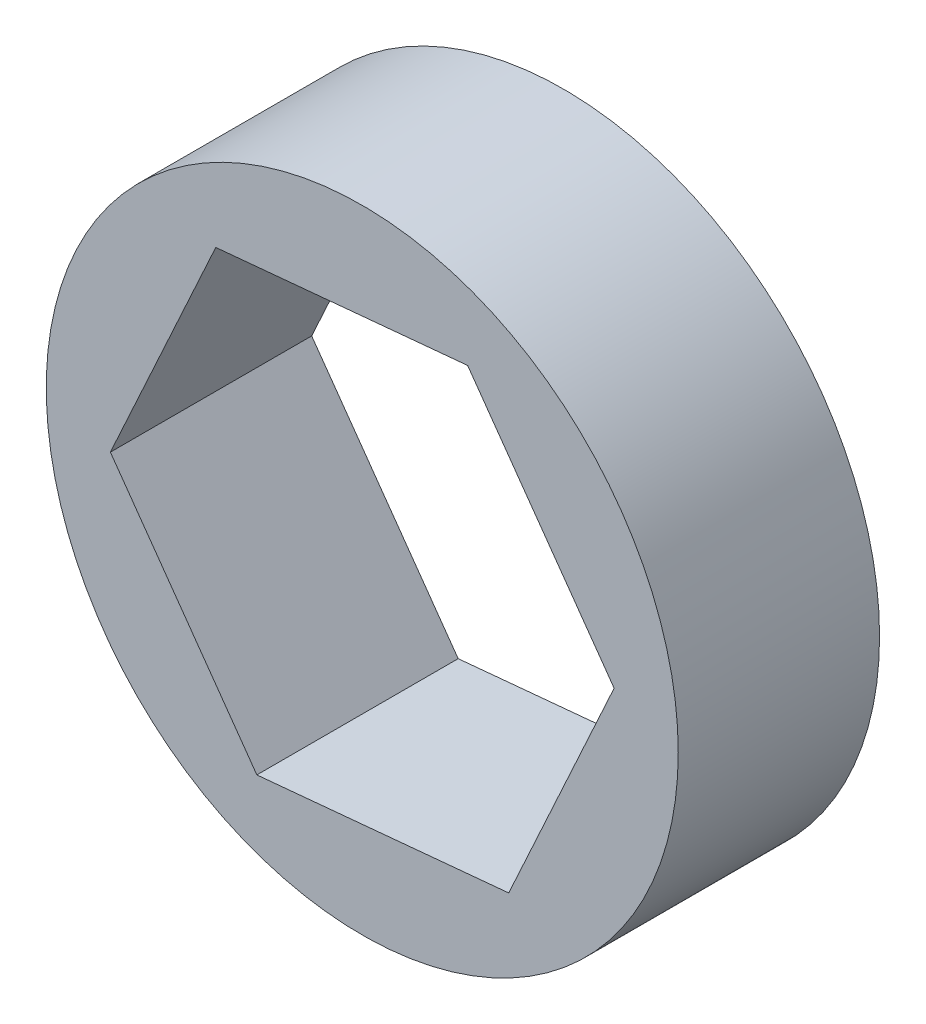
ISO-10303-21;
HEADER;
FILE_DESCRIPTION(('STEP AP214'),'2;1');
FILE_NAME('part.step','',(''),(''),'','','');
FILE_SCHEMA(('AUTOMOTIVE_DESIGN { 1 0 10303 214 1 1 1 1 }'));
ENDSEC;
DATA;
#1=APPLICATION_CONTEXT('core data for automotive mechanical design processes');
#2=APPLICATION_PROTOCOL_DEFINITION('international standard','automotive_design',2000,#1);
#3=PRODUCT_CONTEXT('',#1,'mechanical');
#4=PRODUCT('Part','Part','',(#3));
#5=PRODUCT_RELATED_PRODUCT_CATEGORY('part','',(#4));
#6=PRODUCT_DEFINITION_FORMATION('','',#4);
#7=PRODUCT_DEFINITION_CONTEXT('part definition',#1,'design');
#8=PRODUCT_DEFINITION('design','',#6,#7);
#9=PRODUCT_DEFINITION_SHAPE('','',#8);
#10=(LENGTH_UNIT() NAMED_UNIT(*) SI_UNIT(.MILLI.,.METRE.));
#11=(NAMED_UNIT(*) PLANE_ANGLE_UNIT() SI_UNIT($,.RADIAN.));
#12=(NAMED_UNIT(*) SI_UNIT($,.STERADIAN.) SOLID_ANGLE_UNIT());
#13=UNCERTAINTY_MEASURE_WITH_UNIT(LENGTH_MEASURE(1.E-05),#10,'distance_accuracy_value','');
#14=(GEOMETRIC_REPRESENTATION_CONTEXT(3) GLOBAL_UNCERTAINTY_ASSIGNED_CONTEXT((#13)) GLOBAL_UNIT_ASSIGNED_CONTEXT((#10,
#11,#12)) REPRESENTATION_CONTEXT('',''));
#15=CARTESIAN_POINT('',(0.,0.,0.));
#16=DIRECTION('',(0.,0.,1.));
#17=DIRECTION('',(1.,0.,0.));
#18=AXIS2_PLACEMENT_3D('',#15,#16,#17);
#19=CARTESIAN_POINT('',(0.,0.,6.06806));
#20=DIRECTION('',(0.,0.,1.));
#21=DIRECTION('',(1.,0.,0.));
#22=AXIS2_PLACEMENT_3D('',#19,#20,#21);
#23=PLANE('',#22);
#24=CARTESIAN_POINT('',(0.,0.,6.06806));
#25=DIRECTION('',(0.,0.,1.));
#26=DIRECTION('',(1.,0.,0.));
#27=AXIS2_PLACEMENT_3D('',#24,#25,#26);
#28=CIRCLE('',#27,9.525);
#29=CARTESIAN_POINT('',(9.525,0.,6.06806));
#30=VERTEX_POINT('',#29);
#31=EDGE_CURVE('E11',#30,#30,#28,.T.);
#32=ORIENTED_EDGE('',*,*,#31,.T.);
#33=EDGE_LOOP('',(#32));
#34=FACE_BOUND('',#33,.T.);
#35=DIRECTION('',(-0.416593831263027,-0.90909272340812,0.));
#36=VECTOR('',#35,1.);
#37=CARTESIAN_POINT('',(-4.41525056303659,6.2173936499902,6.06806));
#38=LINE('',#37,#36);
#39=CARTESIAN_POINT('',(-4.41525056303659,6.2173936499902,6.06806));
#40=VERTEX_POINT('',#39);
#41=CARTESIAN_POINT('',(-7.59204612773786,-0.715022326668133,6.06806));
#42=VERTEX_POINT('',#41);
#43=EDGE_CURVE('E94',#40,#42,#38,.T.);
#44=ORIENTED_EDGE('',*,*,#43,.F.);
#45=DIRECTION('',(-0.995594308498526,-0.0937655207703909,0.));
#46=VECTOR('',#45,1.);
#47=CARTESIAN_POINT('',(3.17679556470127,6.93241597665833,6.06806));
#48=LINE('',#47,#46);
#49=CARTESIAN_POINT('',(3.17679556470127,6.93241597665833,6.06806));
#50=VERTEX_POINT('',#49);
#51=EDGE_CURVE('E86',#50,#40,#48,.T.);
#52=ORIENTED_EDGE('',*,*,#51,.F.);
#53=DIRECTION('',(-0.579000477235499,0.815327202637729,0.));
#54=VECTOR('',#53,1.);
#55=CARTESIAN_POINT('',(7.59204612773786,0.715022326668138,6.06806));
#56=LINE('',#55,#54);
#57=CARTESIAN_POINT('',(7.59204612773786,0.715022326668138,6.06806));
#58=VERTEX_POINT('',#57);
#59=EDGE_CURVE('E114',#58,#50,#56,.T.);
#60=ORIENTED_EDGE('',*,*,#59,.F.);
#61=DIRECTION('',(0.416593831263027,0.90909272340812,0.));
#62=VECTOR('',#61,1.);
#63=CARTESIAN_POINT('',(4.41525056303659,-6.21739364999019,6.06806));
#64=LINE('',#63,#62);
#65=CARTESIAN_POINT('',(4.41525056303659,-6.21739364999019,6.06806));
#66=VERTEX_POINT('',#65);
#67=EDGE_CURVE('E112',#66,#58,#64,.T.);
#68=ORIENTED_EDGE('',*,*,#67,.F.);
#69=DIRECTION('',(0.995594308498526,0.0937655207703908,0.));
#70=VECTOR('',#69,1.);
#71=CARTESIAN_POINT('',(-3.17679556470127,-6.93241597665833,6.06806));
#72=LINE('',#71,#70);
#73=CARTESIAN_POINT('',(-3.17679556470127,-6.93241597665833,6.06806));
#74=VERTEX_POINT('',#73);
#75=EDGE_CURVE('E108',#74,#66,#72,.T.);
#76=ORIENTED_EDGE('',*,*,#75,.F.);
#77=DIRECTION('',(0.579000477235498,-0.815327202637729,0.));
#78=VECTOR('',#77,1.);
#79=CARTESIAN_POINT('',(-7.59204612773786,-0.715022326668133,6.06806));
#80=LINE('',#79,#78);
#81=EDGE_CURVE('E106',#42,#74,#80,.T.);
#82=ORIENTED_EDGE('',*,*,#81,.F.);
#83=EDGE_LOOP('',(#44,#52,#60,#68,#76,#82));
#84=FACE_BOUND('',#83,.T.);
#85=ADVANCED_FACE('F33',(#34,#84),#23,.T.);
#86=CARTESIAN_POINT('',(0.,0.,0.));
#87=DIRECTION('',(0.,0.,1.));
#88=DIRECTION('',(1.,0.,0.));
#89=AXIS2_PLACEMENT_3D('',#86,#87,#88);
#90=PLANE('',#89);
#91=CARTESIAN_POINT('',(0.,0.,0.));
#92=DIRECTION('',(0.,0.,1.));
#93=DIRECTION('',(1.,0.,0.));
#94=AXIS2_PLACEMENT_3D('',#91,#92,#93);
#95=CIRCLE('',#94,9.525);
#96=CARTESIAN_POINT('',(9.525,0.,0.));
#97=VERTEX_POINT('',#96);
#98=EDGE_CURVE('E37',#97,#97,#95,.T.);
#99=ORIENTED_EDGE('',*,*,#98,.F.);
#100=EDGE_LOOP('',(#99));
#101=FACE_BOUND('',#100,.T.);
#102=DIRECTION('',(-0.995594308498526,-0.0937655207703909,0.));
#103=VECTOR('',#102,1.);
#104=CARTESIAN_POINT('',(3.17679556470127,6.93241597665833,0.));
#105=LINE('',#104,#103);
#106=CARTESIAN_POINT('',(3.17679556470127,6.93241597665833,0.));
#107=VERTEX_POINT('',#106);
#108=CARTESIAN_POINT('',(-4.41525056303659,6.2173936499902,0.));
#109=VERTEX_POINT('',#108);
#110=EDGE_CURVE('E56',#107,#109,#105,.T.);
#111=ORIENTED_EDGE('',*,*,#110,.T.);
#112=DIRECTION('',(-0.416593831263027,-0.90909272340812,0.));
#113=VECTOR('',#112,1.);
#114=CARTESIAN_POINT('',(-4.41525056303659,6.2173936499902,0.));
#115=LINE('',#114,#113);
#116=CARTESIAN_POINT('',(-7.59204612773786,-0.715022326668133,0.));
#117=VERTEX_POINT('',#116);
#118=EDGE_CURVE('E101',#109,#117,#115,.T.);
#119=ORIENTED_EDGE('',*,*,#118,.T.);
#120=DIRECTION('',(0.579000477235498,-0.815327202637729,0.));
#121=VECTOR('',#120,1.);
#122=CARTESIAN_POINT('',(-7.59204612773786,-0.715022326668133,0.));
#123=LINE('',#122,#121);
#124=CARTESIAN_POINT('',(-3.17679556470127,-6.93241597665833,0.));
#125=VERTEX_POINT('',#124);
#126=EDGE_CURVE('E118',#117,#125,#123,.T.);
#127=ORIENTED_EDGE('',*,*,#126,.T.);
#128=DIRECTION('',(0.995594308498526,0.0937655207703908,0.));
#129=VECTOR('',#128,1.);
#130=CARTESIAN_POINT('',(-3.17679556470127,-6.93241597665833,0.));
#131=LINE('',#130,#129);
#132=CARTESIAN_POINT('',(4.41525056303659,-6.21739364999019,0.));
#133=VERTEX_POINT('',#132);
#134=EDGE_CURVE('E121',#125,#133,#131,.T.);
#135=ORIENTED_EDGE('',*,*,#134,.T.);
#136=DIRECTION('',(0.416593831263027,0.90909272340812,0.));
#137=VECTOR('',#136,1.);
#138=CARTESIAN_POINT('',(4.41525056303659,-6.21739364999019,0.));
#139=LINE('',#138,#137);
#140=CARTESIAN_POINT('',(7.59204612773786,0.715022326668138,0.));
#141=VERTEX_POINT('',#140);
#142=EDGE_CURVE('E124',#133,#141,#139,.T.);
#143=ORIENTED_EDGE('',*,*,#142,.T.);
#144=DIRECTION('',(-0.579000477235499,0.815327202637729,0.));
#145=VECTOR('',#144,1.);
#146=CARTESIAN_POINT('',(7.59204612773786,0.715022326668138,0.));
#147=LINE('',#146,#145);
#148=EDGE_CURVE('E95',#141,#107,#147,.T.);
#149=ORIENTED_EDGE('',*,*,#148,.T.);
#150=EDGE_LOOP('',(#111,#119,#127,#135,#143,#149));
#151=FACE_BOUND('',#150,.T.);
#152=ADVANCED_FACE('F141',(#101,#151),#90,.F.);
#153=CARTESIAN_POINT('',(0.,0.,6.06806));
#154=DIRECTION('',(0.,0.,-1.));
#155=DIRECTION('',(-1.,0.,0.));
#156=AXIS2_PLACEMENT_3D('',#153,#154,#155);
#157=CYLINDRICAL_SURFACE('',#156,9.525);
#158=ORIENTED_EDGE('',*,*,#31,.F.);
#159=EDGE_LOOP('',(#158));
#160=FACE_BOUND('',#159,.T.);
#161=ORIENTED_EDGE('',*,*,#98,.T.);
#162=EDGE_LOOP('',(#161));
#163=FACE_BOUND('',#162,.T.);
#164=ADVANCED_FACE('F35',(#160,#163),#157,.T.);
#165=CARTESIAN_POINT('',(3.17679556470127,6.93241597665833,6.06806));
#166=DIRECTION('',(0.0937655207703909,-0.995594308498526,0.));
#167=DIRECTION('',(0.995594308498526,0.0937655207703909,0.));
#168=AXIS2_PLACEMENT_3D('',#165,#166,#167);
#169=PLANE('',#168);
#170=ORIENTED_EDGE('',*,*,#110,.F.);
#171=DIRECTION('',(0.,0.,-1.));
#172=VECTOR('',#171,1.);
#173=CARTESIAN_POINT('',(3.17679556470127,6.93241597665833,6.06806));
#174=LINE('',#173,#172);
#175=EDGE_CURVE('E90',#50,#107,#174,.T.);
#176=ORIENTED_EDGE('',*,*,#175,.F.);
#177=ORIENTED_EDGE('',*,*,#51,.T.);
#178=DIRECTION('',(0.,0.,-1.));
#179=VECTOR('',#178,1.);
#180=CARTESIAN_POINT('',(-4.41525056303659,6.2173936499902,6.06806));
#181=LINE('',#180,#179);
#182=EDGE_CURVE('E89',#40,#109,#181,.T.);
#183=ORIENTED_EDGE('',*,*,#182,.T.);
#184=EDGE_LOOP('',(#170,#176,#177,#183));
#185=FACE_BOUND('',#184,.T.);
#186=ADVANCED_FACE('F88',(#185),#169,.T.);
#187=CARTESIAN_POINT('',(-4.41525056303659,6.2173936499902,6.06806));
#188=DIRECTION('',(0.90909272340812,-0.416593831263027,0.));
#189=DIRECTION('',(0.416593831263027,0.90909272340812,0.));
#190=AXIS2_PLACEMENT_3D('',#187,#188,#189);
#191=PLANE('',#190);
#192=ORIENTED_EDGE('',*,*,#118,.F.);
#193=ORIENTED_EDGE('',*,*,#182,.F.);
#194=ORIENTED_EDGE('',*,*,#43,.T.);
#195=DIRECTION('',(0.,0.,-1.));
#196=VECTOR('',#195,1.);
#197=CARTESIAN_POINT('',(-7.59204612773786,-0.715022326668133,6.06806));
#198=LINE('',#197,#196);
#199=EDGE_CURVE('E102',#42,#117,#198,.T.);
#200=ORIENTED_EDGE('',*,*,#199,.T.);
#201=EDGE_LOOP('',(#192,#193,#194,#200));
#202=FACE_BOUND('',#201,.T.);
#203=ADVANCED_FACE('F98',(#202),#191,.T.);
#204=CARTESIAN_POINT('',(-7.59204612773786,-0.715022326668133,6.06806));
#205=DIRECTION('',(0.815327202637729,0.579000477235499,0.));
#206=DIRECTION('',(-0.579000477235499,0.815327202637729,0.));
#207=AXIS2_PLACEMENT_3D('',#204,#205,#206);
#208=PLANE('',#207);
#209=ORIENTED_EDGE('',*,*,#126,.F.);
#210=ORIENTED_EDGE('',*,*,#199,.F.);
#211=ORIENTED_EDGE('',*,*,#81,.T.);
#212=DIRECTION('',(0.,0.,-1.));
#213=VECTOR('',#212,1.);
#214=CARTESIAN_POINT('',(-3.17679556470127,-6.93241597665833,6.06806));
#215=LINE('',#214,#213);
#216=EDGE_CURVE('E133',#74,#125,#215,.T.);
#217=ORIENTED_EDGE('',*,*,#216,.T.);
#218=EDGE_LOOP('',(#209,#210,#211,#217));
#219=FACE_BOUND('',#218,.T.);
#220=ADVANCED_FACE('F137',(#219),#208,.T.);
#221=CARTESIAN_POINT('',(-3.17679556470127,-6.93241597665833,6.06806));
#222=DIRECTION('',(-0.0937655207703908,0.995594308498526,0.));
#223=DIRECTION('',(-0.995594308498526,-0.0937655207703908,0.));
#224=AXIS2_PLACEMENT_3D('',#221,#222,#223);
#225=PLANE('',#224);
#226=ORIENTED_EDGE('',*,*,#134,.F.);
#227=ORIENTED_EDGE('',*,*,#216,.F.);
#228=ORIENTED_EDGE('',*,*,#75,.T.);
#229=DIRECTION('',(0.,0.,-1.));
#230=VECTOR('',#229,1.);
#231=CARTESIAN_POINT('',(4.41525056303659,-6.21739364999019,6.06806));
#232=LINE('',#231,#230);
#233=EDGE_CURVE('E131',#66,#133,#232,.T.);
#234=ORIENTED_EDGE('',*,*,#233,.T.);
#235=EDGE_LOOP('',(#226,#227,#228,#234));
#236=FACE_BOUND('',#235,.T.);
#237=ADVANCED_FACE('F149',(#236),#225,.T.);
#238=CARTESIAN_POINT('',(4.41525056303659,-6.21739364999019,6.06806));
#239=DIRECTION('',(-0.90909272340812,0.416593831263027,0.));
#240=DIRECTION('',(-0.416593831263027,-0.90909272340812,0.));
#241=AXIS2_PLACEMENT_3D('',#238,#239,#240);
#242=PLANE('',#241);
#243=ORIENTED_EDGE('',*,*,#142,.F.);
#244=ORIENTED_EDGE('',*,*,#233,.F.);
#245=ORIENTED_EDGE('',*,*,#67,.T.);
#246=DIRECTION('',(0.,0.,-1.));
#247=VECTOR('',#246,1.);
#248=CARTESIAN_POINT('',(7.59204612773786,0.715022326668138,6.06806));
#249=LINE('',#248,#247);
#250=EDGE_CURVE('E48',#58,#141,#249,.T.);
#251=ORIENTED_EDGE('',*,*,#250,.T.);
#252=EDGE_LOOP('',(#243,#244,#245,#251));
#253=FACE_BOUND('',#252,.T.);
#254=ADVANCED_FACE('F147',(#253),#242,.T.);
#255=CARTESIAN_POINT('',(7.59204612773786,0.715022326668138,6.06806));
#256=DIRECTION('',(-0.815327202637729,-0.579000477235499,0.));
#257=DIRECTION('',(0.579000477235499,-0.815327202637729,0.));
#258=AXIS2_PLACEMENT_3D('',#255,#256,#257);
#259=PLANE('',#258);
#260=ORIENTED_EDGE('',*,*,#148,.F.);
#261=ORIENTED_EDGE('',*,*,#250,.F.);
#262=ORIENTED_EDGE('',*,*,#59,.T.);
#263=ORIENTED_EDGE('',*,*,#175,.T.);
#264=EDGE_LOOP('',(#260,#261,#262,#263));
#265=FACE_BOUND('',#264,.T.);
#266=ADVANCED_FACE('F143',(#265),#259,.T.);
#267=CLOSED_SHELL('',(#85,#152,#164,#186,#203,#220,#237,#254,#266));
#268=MANIFOLD_SOLID_BREP('B2',#267);
#269=ADVANCED_BREP_SHAPE_REPRESENTATION('',(#18,#268),#14);
#270=SHAPE_DEFINITION_REPRESENTATION(#9,#269);
ENDSEC;
END-ISO-10303-21;
